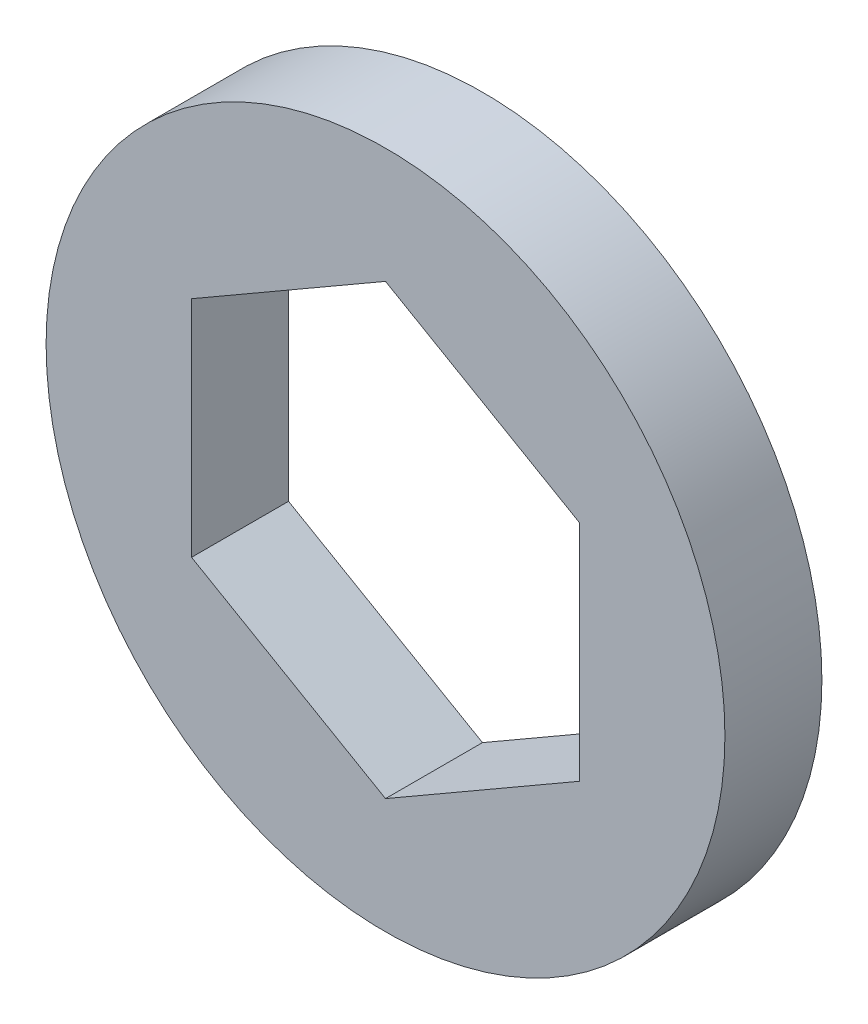
ISO-10303-21;
HEADER;
FILE_DESCRIPTION(('STEP AP214'),'2;1');
FILE_NAME('part.step','',(''),(''),'','','');
FILE_SCHEMA(('AUTOMOTIVE_DESIGN { 1 0 10303 214 1 1 1 1 }'));
ENDSEC;
DATA;
#1=APPLICATION_CONTEXT('core data for automotive mechanical design processes');
#2=APPLICATION_PROTOCOL_DEFINITION('international standard','automotive_design',2000,#1);
#3=PRODUCT_CONTEXT('',#1,'mechanical');
#4=PRODUCT('Part','Part','',(#3));
#5=PRODUCT_RELATED_PRODUCT_CATEGORY('part','',(#4));
#6=PRODUCT_DEFINITION_FORMATION('','',#4);
#7=PRODUCT_DEFINITION_CONTEXT('part definition',#1,'design');
#8=PRODUCT_DEFINITION('design','',#6,#7);
#9=PRODUCT_DEFINITION_SHAPE('','',#8);
#10=(LENGTH_UNIT() NAMED_UNIT(*) SI_UNIT(.MILLI.,.METRE.));
#11=(NAMED_UNIT(*) PLANE_ANGLE_UNIT() SI_UNIT($,.RADIAN.));
#12=(NAMED_UNIT(*) SI_UNIT($,.STERADIAN.) SOLID_ANGLE_UNIT());
#13=UNCERTAINTY_MEASURE_WITH_UNIT(LENGTH_MEASURE(1.E-05),#10,'distance_accuracy_value','');
#14=(GEOMETRIC_REPRESENTATION_CONTEXT(3) GLOBAL_UNCERTAINTY_ASSIGNED_CONTEXT((#13)) GLOBAL_UNIT_ASSIGNED_CONTEXT((#10,
#11,#12)) REPRESENTATION_CONTEXT('',''));
#15=CARTESIAN_POINT('',(0.,0.,0.));
#16=DIRECTION('',(0.,0.,1.));
#17=DIRECTION('',(1.,0.,0.));
#18=AXIS2_PLACEMENT_3D('',#15,#16,#17);
#19=CARTESIAN_POINT('',(0.,0.,3.175));
#20=DIRECTION('',(0.,0.,1.));
#21=DIRECTION('',(1.,0.,0.));
#22=AXIS2_PLACEMENT_3D('',#19,#20,#21);
#23=PLANE('',#22);
#24=CARTESIAN_POINT('',(0.,0.,3.175));
#25=DIRECTION('',(0.,0.,1.));
#26=DIRECTION('',(1.,0.,0.));
#27=AXIS2_PLACEMENT_3D('',#24,#25,#26);
#28=CIRCLE('',#27,11.1125);
#29=CARTESIAN_POINT('',(11.1125,0.,3.175));
#30=VERTEX_POINT('',#29);
#31=EDGE_CURVE('E11',#30,#30,#28,.T.);
#32=ORIENTED_EDGE('',*,*,#31,.T.);
#33=EDGE_LOOP('',(#32));
#34=FACE_BOUND('',#33,.T.);
#35=DIRECTION('',(-0.866025403784438,-0.500000000000001,0.));
#36=VECTOR('',#35,1.);
#37=CARTESIAN_POINT('',(0.,7.33234841870825,3.175));
#38=LINE('',#37,#36);
#39=CARTESIAN_POINT('',(0.,7.33234841870825,3.175));
#40=VERTEX_POINT('',#39);
#41=CARTESIAN_POINT('',(-6.35000000000001,3.66617420935411,3.175));
#42=VERTEX_POINT('',#41);
#43=EDGE_CURVE('E106',#40,#42,#38,.T.);
#44=ORIENTED_EDGE('',*,*,#43,.F.);
#45=DIRECTION('',(-0.866025403784441,0.499999999999995,0.));
#46=VECTOR('',#45,1.);
#47=CARTESIAN_POINT('',(6.34999999999996,3.6661742093542,3.175));
#48=LINE('',#47,#46);
#49=CARTESIAN_POINT('',(6.34999999999996,3.6661742093542,3.175));
#50=VERTEX_POINT('',#49);
#51=EDGE_CURVE('E97',#50,#40,#48,.T.);
#52=ORIENTED_EDGE('',*,*,#51,.F.);
#53=DIRECTION('',(0.,1.,0.));
#54=VECTOR('',#53,1.);
#55=CARTESIAN_POINT('',(6.35000000000003,-3.66617420935406,3.175));
#56=LINE('',#55,#54);
#57=CARTESIAN_POINT('',(6.35000000000003,-3.66617420935406,3.175));
#58=VERTEX_POINT('',#57);
#59=EDGE_CURVE('E131',#58,#50,#56,.T.);
#60=ORIENTED_EDGE('',*,*,#59,.F.);
#61=DIRECTION('',(0.866025403784434,0.500000000000007,0.));
#62=VECTOR('',#61,1.);
#63=CARTESIAN_POINT('',(0.,-7.33234841870825,3.175));
#64=LINE('',#63,#62);
#65=CARTESIAN_POINT('',(0.,-7.33234841870825,3.175));
#66=VERTEX_POINT('',#65);
#67=EDGE_CURVE('E128',#66,#58,#64,.T.);
#68=ORIENTED_EDGE('',*,*,#67,.F.);
#69=DIRECTION('',(0.866025403784442,-0.499999999999995,0.));
#70=VECTOR('',#69,1.);
#71=CARTESIAN_POINT('',(-6.34999999999998,-3.66617420935415,3.175));
#72=LINE('',#71,#70);
#73=CARTESIAN_POINT('',(-6.34999999999998,-3.66617420935415,3.175));
#74=VERTEX_POINT('',#73);
#75=EDGE_CURVE('E123',#74,#66,#72,.T.);
#76=ORIENTED_EDGE('',*,*,#75,.F.);
#77=DIRECTION('',(0.,-1.,0.));
#78=VECTOR('',#77,1.);
#79=CARTESIAN_POINT('',(-6.35000000000001,3.66617420935411,3.175));
#80=LINE('',#79,#78);
#81=EDGE_CURVE('E119',#42,#74,#80,.T.);
#82=ORIENTED_EDGE('',*,*,#81,.F.);
#83=EDGE_LOOP('',(#44,#52,#60,#68,#76,#82));
#84=FACE_BOUND('',#83,.T.);
#85=ADVANCED_FACE('F43',(#34,#84),#23,.T.);
#86=CARTESIAN_POINT('',(0.,0.,0.));
#87=DIRECTION('',(0.,0.,1.));
#88=DIRECTION('',(1.,0.,0.));
#89=AXIS2_PLACEMENT_3D('',#86,#87,#88);
#90=PLANE('',#89);
#91=CARTESIAN_POINT('',(0.,0.,0.));
#92=DIRECTION('',(0.,0.,1.));
#93=DIRECTION('',(1.,0.,0.));
#94=AXIS2_PLACEMENT_3D('',#91,#92,#93);
#95=CIRCLE('',#94,11.1125);
#96=CARTESIAN_POINT('',(11.1125,0.,0.));
#97=VERTEX_POINT('',#96);
#98=EDGE_CURVE('E47',#97,#97,#95,.T.);
#99=ORIENTED_EDGE('',*,*,#98,.F.);
#100=EDGE_LOOP('',(#99));
#101=FACE_BOUND('',#100,.T.);
#102=DIRECTION('',(-0.866025403784441,0.499999999999995,0.));
#103=VECTOR('',#102,1.);
#104=CARTESIAN_POINT('',(6.34999999999996,3.6661742093542,0.));
#105=LINE('',#104,#103);
#106=CARTESIAN_POINT('',(6.34999999999996,3.6661742093542,0.));
#107=VERTEX_POINT('',#106);
#108=CARTESIAN_POINT('',(0.,7.33234841870825,0.));
#109=VERTEX_POINT('',#108);
#110=EDGE_CURVE('E67',#107,#109,#105,.T.);
#111=ORIENTED_EDGE('',*,*,#110,.T.);
#112=DIRECTION('',(-0.866025403784438,-0.500000000000001,0.));
#113=VECTOR('',#112,1.);
#114=CARTESIAN_POINT('',(0.,7.33234841870825,0.));
#115=LINE('',#114,#113);
#116=CARTESIAN_POINT('',(-6.35000000000001,3.66617420935411,0.));
#117=VERTEX_POINT('',#116);
#118=EDGE_CURVE('E113',#109,#117,#115,.T.);
#119=ORIENTED_EDGE('',*,*,#118,.T.);
#120=DIRECTION('',(0.,-1.,0.));
#121=VECTOR('',#120,1.);
#122=CARTESIAN_POINT('',(-6.35000000000001,3.66617420935411,0.));
#123=LINE('',#122,#121);
#124=CARTESIAN_POINT('',(-6.34999999999998,-3.66617420935415,0.));
#125=VERTEX_POINT('',#124);
#126=EDGE_CURVE('E138',#117,#125,#123,.T.);
#127=ORIENTED_EDGE('',*,*,#126,.T.);
#128=DIRECTION('',(0.866025403784442,-0.499999999999995,0.));
#129=VECTOR('',#128,1.);
#130=CARTESIAN_POINT('',(-6.34999999999998,-3.66617420935415,0.));
#131=LINE('',#130,#129);
#132=CARTESIAN_POINT('',(0.,-7.33234841870825,0.));
#133=VERTEX_POINT('',#132);
#134=EDGE_CURVE('E142',#125,#133,#131,.T.);
#135=ORIENTED_EDGE('',*,*,#134,.T.);
#136=DIRECTION('',(0.866025403784434,0.500000000000007,0.));
#137=VECTOR('',#136,1.);
#138=CARTESIAN_POINT('',(0.,-7.33234841870825,0.));
#139=LINE('',#138,#137);
#140=CARTESIAN_POINT('',(6.35000000000003,-3.66617420935406,0.));
#141=VERTEX_POINT('',#140);
#142=EDGE_CURVE('E146',#133,#141,#139,.T.);
#143=ORIENTED_EDGE('',*,*,#142,.T.);
#144=DIRECTION('',(0.,1.,0.));
#145=VECTOR('',#144,1.);
#146=CARTESIAN_POINT('',(6.35000000000003,-3.66617420935406,0.));
#147=LINE('',#146,#145);
#148=EDGE_CURVE('E107',#141,#107,#147,.T.);
#149=ORIENTED_EDGE('',*,*,#148,.T.);
#150=EDGE_LOOP('',(#111,#119,#127,#135,#143,#149));
#151=FACE_BOUND('',#150,.T.);
#152=ADVANCED_FACE('F170',(#101,#151),#90,.F.);
#153=CARTESIAN_POINT('',(0.,0.,3.175));
#154=DIRECTION('',(0.,0.,-1.));
#155=DIRECTION('',(-1.,0.,0.));
#156=AXIS2_PLACEMENT_3D('',#153,#154,#155);
#157=CYLINDRICAL_SURFACE('',#156,11.1125);
#158=ORIENTED_EDGE('',*,*,#31,.F.);
#159=EDGE_LOOP('',(#158));
#160=FACE_BOUND('',#159,.T.);
#161=ORIENTED_EDGE('',*,*,#98,.T.);
#162=EDGE_LOOP('',(#161));
#163=FACE_BOUND('',#162,.T.);
#164=ADVANCED_FACE('F45',(#160,#163),#157,.T.);
#165=CARTESIAN_POINT('',(6.34999999999996,3.6661742093542,3.175));
#166=DIRECTION('',(-0.499999999999995,-0.866025403784441,0.));
#167=DIRECTION('',(0.866025403784441,-0.499999999999995,0.));
#168=AXIS2_PLACEMENT_3D('',#165,#166,#167);
#169=PLANE('',#168);
#170=ORIENTED_EDGE('',*,*,#110,.F.);
#171=DIRECTION('',(0.,0.,-1.));
#172=VECTOR('',#171,1.);
#173=CARTESIAN_POINT('',(6.34999999999996,3.6661742093542,3.175));
#174=LINE('',#173,#172);
#175=EDGE_CURVE('E101',#50,#107,#174,.T.);
#176=ORIENTED_EDGE('',*,*,#175,.F.);
#177=ORIENTED_EDGE('',*,*,#51,.T.);
#178=DIRECTION('',(0.,0.,-1.));
#179=VECTOR('',#178,1.);
#180=CARTESIAN_POINT('',(0.,7.33234841870825,3.175));
#181=LINE('',#180,#179);
#182=EDGE_CURVE('E100',#40,#109,#181,.T.);
#183=ORIENTED_EDGE('',*,*,#182,.T.);
#184=EDGE_LOOP('',(#170,#176,#177,#183));
#185=FACE_BOUND('',#184,.T.);
#186=ADVANCED_FACE('F99',(#185),#169,.T.);
#187=CARTESIAN_POINT('',(0.,7.33234841870825,3.175));
#188=DIRECTION('',(0.500000000000001,-0.866025403784438,0.));
#189=DIRECTION('',(0.866025403784438,0.500000000000001,0.));
#190=AXIS2_PLACEMENT_3D('',#187,#188,#189);
#191=PLANE('',#190);
#192=ORIENTED_EDGE('',*,*,#118,.F.);
#193=ORIENTED_EDGE('',*,*,#182,.F.);
#194=ORIENTED_EDGE('',*,*,#43,.T.);
#195=DIRECTION('',(0.,0.,-1.));
#196=VECTOR('',#195,1.);
#197=CARTESIAN_POINT('',(-6.35000000000001,3.66617420935411,3.175));
#198=LINE('',#197,#196);
#199=EDGE_CURVE('E115',#42,#117,#198,.T.);
#200=ORIENTED_EDGE('',*,*,#199,.T.);
#201=EDGE_LOOP('',(#192,#193,#194,#200));
#202=FACE_BOUND('',#201,.T.);
#203=ADVANCED_FACE('F110',(#202),#191,.T.);
#204=CARTESIAN_POINT('',(-6.35000000000001,3.66617420935411,3.175));
#205=DIRECTION('',(1.,0.,0.));
#206=DIRECTION('',(0.,1.,0.));
#207=AXIS2_PLACEMENT_3D('',#204,#205,#206);
#208=PLANE('',#207);
#209=ORIENTED_EDGE('',*,*,#126,.F.);
#210=ORIENTED_EDGE('',*,*,#199,.F.);
#211=ORIENTED_EDGE('',*,*,#81,.T.);
#212=DIRECTION('',(0.,0.,-1.));
#213=VECTOR('',#212,1.);
#214=CARTESIAN_POINT('',(-6.34999999999998,-3.66617420935415,3.175));
#215=LINE('',#214,#213);
#216=EDGE_CURVE('E160',#74,#125,#215,.T.);
#217=ORIENTED_EDGE('',*,*,#216,.T.);
#218=EDGE_LOOP('',(#209,#210,#211,#217));
#219=FACE_BOUND('',#218,.T.);
#220=ADVANCED_FACE('F166',(#219),#208,.T.);
#221=CARTESIAN_POINT('',(-6.34999999999998,-3.66617420935415,3.175));
#222=DIRECTION('',(0.499999999999995,0.866025403784441,0.));
#223=DIRECTION('',(-0.866025403784442,0.499999999999995,0.));
#224=AXIS2_PLACEMENT_3D('',#221,#222,#223);
#225=PLANE('',#224);
#226=ORIENTED_EDGE('',*,*,#134,.F.);
#227=ORIENTED_EDGE('',*,*,#216,.F.);
#228=ORIENTED_EDGE('',*,*,#75,.T.);
#229=DIRECTION('',(0.,0.,-1.));
#230=VECTOR('',#229,1.);
#231=CARTESIAN_POINT('',(0.,-7.33234841870825,3.175));
#232=LINE('',#231,#230);
#233=EDGE_CURVE('E157',#66,#133,#232,.T.);
#234=ORIENTED_EDGE('',*,*,#233,.T.);
#235=EDGE_LOOP('',(#226,#227,#228,#234));
#236=FACE_BOUND('',#235,.T.);
#237=ADVANCED_FACE('F178',(#236),#225,.T.);
#238=CARTESIAN_POINT('',(0.,-7.33234841870825,3.175));
#239=DIRECTION('',(-0.500000000000007,0.866025403784434,0.));
#240=DIRECTION('',(-0.866025403784435,-0.500000000000007,0.));
#241=AXIS2_PLACEMENT_3D('',#238,#239,#240);
#242=PLANE('',#241);
#243=ORIENTED_EDGE('',*,*,#142,.F.);
#244=ORIENTED_EDGE('',*,*,#233,.F.);
#245=ORIENTED_EDGE('',*,*,#67,.T.);
#246=DIRECTION('',(0.,0.,-1.));
#247=VECTOR('',#246,1.);
#248=CARTESIAN_POINT('',(6.35000000000003,-3.66617420935406,3.175));
#249=LINE('',#248,#247);
#250=EDGE_CURVE('E59',#58,#141,#249,.T.);
#251=ORIENTED_EDGE('',*,*,#250,.T.);
#252=EDGE_LOOP('',(#243,#244,#245,#251));
#253=FACE_BOUND('',#252,.T.);
#254=ADVANCED_FACE('F176',(#253),#242,.T.);
#255=CARTESIAN_POINT('',(6.35000000000003,-3.66617420935406,3.175));
#256=DIRECTION('',(-1.,0.,0.));
#257=DIRECTION('',(0.,-1.,0.));
#258=AXIS2_PLACEMENT_3D('',#255,#256,#257);
#259=PLANE('',#258);
#260=ORIENTED_EDGE('',*,*,#148,.F.);
#261=ORIENTED_EDGE('',*,*,#250,.F.);
#262=ORIENTED_EDGE('',*,*,#59,.T.);
#263=ORIENTED_EDGE('',*,*,#175,.T.);
#264=EDGE_LOOP('',(#260,#261,#262,#263));
#265=FACE_BOUND('',#264,.T.);
#266=ADVANCED_FACE('F172',(#265),#259,.T.);
#267=CLOSED_SHELL('',(#85,#152,#164,#186,#203,#220,#237,#254,#266));
#268=MANIFOLD_SOLID_BREP('B2',#267);
#269=ADVANCED_BREP_SHAPE_REPRESENTATION('',(#18,#268),#14);
#270=SHAPE_DEFINITION_REPRESENTATION(#9,#269);
ENDSEC;
END-ISO-10303-21;
